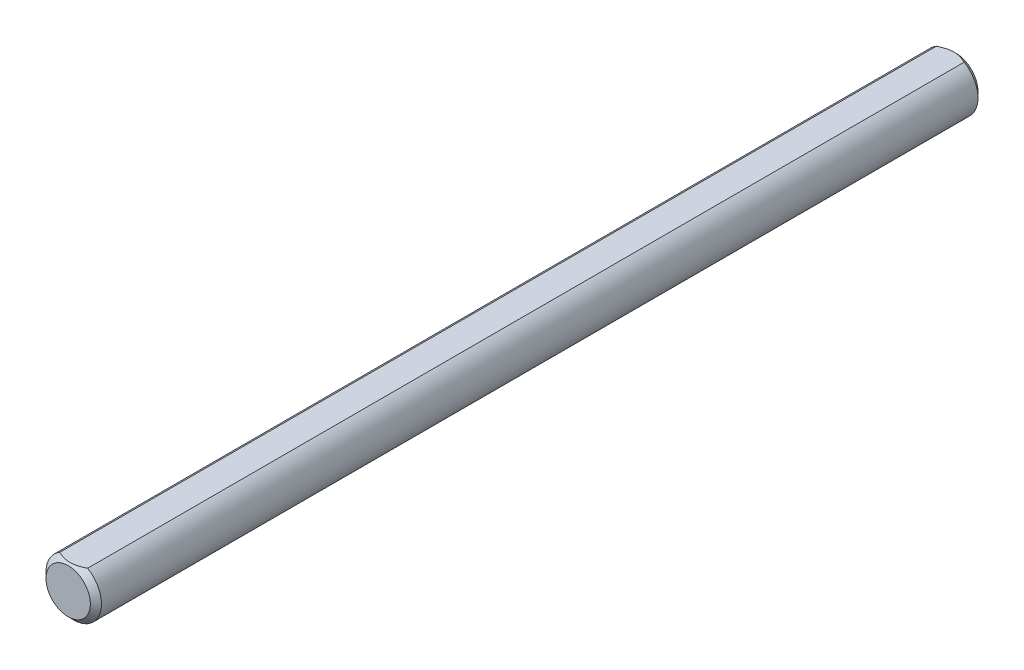
ISO-10303-21;
HEADER;
FILE_DESCRIPTION(('STEP AP214'),'2;1');
FILE_NAME('part.step','',(''),(''),'','','');
FILE_SCHEMA(('AUTOMOTIVE_DESIGN { 1 0 10303 214 1 1 1 1 }'));
ENDSEC;
DATA;
#1=APPLICATION_CONTEXT('core data for automotive mechanical design processes');
#2=APPLICATION_PROTOCOL_DEFINITION('international standard','automotive_design',2000,#1);
#3=PRODUCT_CONTEXT('',#1,'mechanical');
#4=PRODUCT('Part','Part','',(#3));
#5=PRODUCT_RELATED_PRODUCT_CATEGORY('part','',(#4));
#6=PRODUCT_DEFINITION_FORMATION('','',#4);
#7=PRODUCT_DEFINITION_CONTEXT('part definition',#1,'design');
#8=PRODUCT_DEFINITION('design','',#6,#7);
#9=PRODUCT_DEFINITION_SHAPE('','',#8);
#10=(LENGTH_UNIT() NAMED_UNIT(*) SI_UNIT(.MILLI.,.METRE.));
#11=(NAMED_UNIT(*) PLANE_ANGLE_UNIT() SI_UNIT($,.RADIAN.));
#12=(NAMED_UNIT(*) SI_UNIT($,.STERADIAN.) SOLID_ANGLE_UNIT());
#13=UNCERTAINTY_MEASURE_WITH_UNIT(LENGTH_MEASURE(1.E-05),#10,'distance_accuracy_value','');
#14=(GEOMETRIC_REPRESENTATION_CONTEXT(3) GLOBAL_UNCERTAINTY_ASSIGNED_CONTEXT((#13)) GLOBAL_UNIT_ASSIGNED_CONTEXT((#10,
#11,#12)) REPRESENTATION_CONTEXT('',''));
#15=CARTESIAN_POINT('',(0.,0.,0.));
#16=DIRECTION('',(0.,0.,1.));
#17=DIRECTION('',(1.,0.,0.));
#18=AXIS2_PLACEMENT_3D('',#15,#16,#17);
#19=CARTESIAN_POINT('',(0.,0.,50.8));
#20=DIRECTION('',(0.,0.,-1.));
#21=DIRECTION('',(-1.,0.,0.));
#22=AXIS2_PLACEMENT_3D('',#19,#20,#21);
#23=CYLINDRICAL_SURFACE('',#22,3.175);
#24=CARTESIAN_POINT('',(0.,0.,50.165));
#25=DIRECTION('',(0.,0.,1.));
#26=DIRECTION('',(1.,0.,0.));
#27=AXIS2_PLACEMENT_3D('',#24,#25,#26);
#28=CIRCLE('',#27,3.175);
#29=CARTESIAN_POINT('',(1.5875,2.74963065701559,50.165));
#30=VERTEX_POINT('',#29);
#31=CARTESIAN_POINT('',(-1.5875,2.74963065701559,50.165));
#32=VERTEX_POINT('',#31);
#33=EDGE_CURVE('E74',#30,#32,#28,.F.);
#34=ORIENTED_EDGE('',*,*,#33,.T.);
#35=DIRECTION('',(0.,0.,1.));
#36=VECTOR('',#35,1.);
#37=CARTESIAN_POINT('',(-1.5875,2.74963065701559,-50.8));
#38=LINE('',#37,#36);
#39=CARTESIAN_POINT('',(-1.5875,2.74963065701559,-50.165));
#40=VERTEX_POINT('',#39);
#41=EDGE_CURVE('E52',#40,#32,#38,.T.);
#42=ORIENTED_EDGE('',*,*,#41,.F.);
#43=CARTESIAN_POINT('',(0.,0.,-50.165));
#44=DIRECTION('',(0.,0.,1.));
#45=DIRECTION('',(1.,0.,0.));
#46=AXIS2_PLACEMENT_3D('',#43,#44,#45);
#47=CIRCLE('',#46,3.175);
#48=CARTESIAN_POINT('',(1.5875,2.74963065701559,-50.165));
#49=VERTEX_POINT('',#48);
#50=EDGE_CURVE('E73',#40,#49,#47,.T.);
#51=ORIENTED_EDGE('',*,*,#50,.T.);
#52=DIRECTION('',(0.,0.,1.));
#53=VECTOR('',#52,1.);
#54=CARTESIAN_POINT('',(1.5875,2.74963065701559,-50.8));
#55=LINE('',#54,#53);
#56=EDGE_CURVE('E62',#49,#30,#55,.T.);
#57=ORIENTED_EDGE('',*,*,#56,.T.);
#58=EDGE_LOOP('',(#34,#42,#51,#57));
#59=FACE_BOUND('',#58,.T.);
#60=ADVANCED_FACE('F33',(#59),#23,.T.);
#61=CARTESIAN_POINT('',(0.,0.,50.8));
#62=DIRECTION('',(0.,0.,1.));
#63=DIRECTION('',(1.,0.,0.));
#64=AXIS2_PLACEMENT_3D('',#61,#62,#63);
#65=PLANE('',#64);
#66=CARTESIAN_POINT('',(0.,0.,50.8));
#67=DIRECTION('',(0.,0.,1.));
#68=DIRECTION('',(1.,0.,0.));
#69=AXIS2_PLACEMENT_3D('',#66,#67,#68);
#70=CIRCLE('',#69,2.54);
#71=CARTESIAN_POINT('',(2.54,0.,50.8));
#72=VERTEX_POINT('',#71);
#73=EDGE_CURVE('E46',#72,#72,#70,.T.);
#74=ORIENTED_EDGE('',*,*,#73,.T.);
#75=EDGE_LOOP('',(#74));
#76=FACE_BOUND('',#75,.T.);
#77=ADVANCED_FACE('F84',(#76),#65,.T.);
#78=CARTESIAN_POINT('',(0.,0.,-50.8));
#79=DIRECTION('',(0.,0.,1.));
#80=DIRECTION('',(1.,0.,0.));
#81=AXIS2_PLACEMENT_3D('',#78,#79,#80);
#82=PLANE('',#81);
#83=CARTESIAN_POINT('',(0.,0.,-50.8));
#84=DIRECTION('',(0.,0.,1.));
#85=DIRECTION('',(1.,0.,0.));
#86=AXIS2_PLACEMENT_3D('',#83,#84,#85);
#87=CIRCLE('',#86,2.54000000000001);
#88=CARTESIAN_POINT('',(2.54000000000001,0.,-50.8));
#89=VERTEX_POINT('',#88);
#90=EDGE_CURVE('E76',#89,#89,#87,.F.);
#91=ORIENTED_EDGE('',*,*,#90,.T.);
#92=EDGE_LOOP('',(#91));
#93=FACE_BOUND('',#92,.T.);
#94=ADVANCED_FACE('F92',(#93),#82,.F.);
#95=CARTESIAN_POINT('',(0.,0.,-50.165));
#96=DIRECTION('',(0.,0.,1.));
#97=DIRECTION('',(1.,0.,0.));
#98=AXIS2_PLACEMENT_3D('',#95,#96,#97);
#99=CONICAL_SURFACE('',#98,3.175,0.785398163397451);
#100=CARTESIAN_POINT('',(-3.22896135223731,2.74963065701559,-49.0989317189838));
#101=CARTESIAN_POINT('',(-3.15061649550106,2.74963065701559,-49.158566524546));
#102=CARTESIAN_POINT('',(-3.07184009651264,2.74963065701559,-49.217643482025));
#103=CARTESIAN_POINT('',(-2.91325130568819,2.74963065701559,-49.3344297176183));
#104=CARTESIAN_POINT('',(-2.83343866506295,2.74963065701559,-49.3921386575258));
#105=CARTESIAN_POINT('',(-2.67202062852747,2.74963065701559,-49.5063475478051));
#106=CARTESIAN_POINT('',(-2.59040613970429,2.74963065701559,-49.5628346895372));
#107=CARTESIAN_POINT('',(-2.42580311622164,2.74963065701559,-49.6737635143344));
#108=CARTESIAN_POINT('',(-2.34281467809335,2.74963065701559,-49.7282053402285));
#109=CARTESIAN_POINT('',(-2.17021447787229,2.74963065701559,-49.8377738711657));
#110=CARTESIAN_POINT('',(-2.08050398524193,2.74963065701559,-49.8927458353402));
#111=CARTESIAN_POINT('',(-1.89900904678691,2.74963065701559,-49.9991469931979));
#112=CARTESIAN_POINT('',(-1.80722487525635,2.74963065701559,-50.0505766518349));
#113=CARTESIAN_POINT('',(-1.6215376036893,2.74963065701559,-50.1488148050514));
#114=CARTESIAN_POINT('',(-1.52764140922494,2.74963065701559,-50.1956362501767));
#115=CARTESIAN_POINT('',(-1.337247065721,2.74963065701559,-50.2836008153407));
#116=CARTESIAN_POINT('',(-1.24075014112708,2.74963065701559,-50.3247465535942));
#117=CARTESIAN_POINT('',(-1.05364742760749,2.74963065701559,-50.3965564372305));
#118=CARTESIAN_POINT('',(-0.963276425588638,2.74963065701559,-50.4278260439733));
#119=CARTESIAN_POINT('',(-0.7803037351611,2.74963065701559,-50.4831231873505));
#120=CARTESIAN_POINT('',(-0.687701898779459,2.74963065701559,-50.5071502421446));
#121=CARTESIAN_POINT('',(-0.502391431282847,2.74963065701559,-50.5462882908411));
#122=CARTESIAN_POINT('',(-0.40971644514675,2.74963065701559,-50.5615559547489));
#123=CARTESIAN_POINT('',(-0.22330633068526,2.74963065701559,-50.5828688420294));
#124=CARTESIAN_POINT('',(-0.129571403437362,2.74963065701559,-50.5889157860141));
#125=CARTESIAN_POINT('',(0.0543357559016831,2.74963065701559,-50.5913094852485));
#126=CARTESIAN_POINT('',(0.144503242552372,2.74963065701559,-50.5880280862278));
#127=CARTESIAN_POINT('',(0.324095543573417,2.74963065701559,-50.5727817719638));
#128=CARTESIAN_POINT('',(0.413520286896871,2.74963065701559,-50.5608160354814));
#129=CARTESIAN_POINT('',(0.592496066024077,2.74963065701559,-50.5286615235362));
#130=CARTESIAN_POINT('',(0.682021177379022,2.74963065701559,-50.5083305801752));
#131=CARTESIAN_POINT('',(0.859103373963829,2.74963065701559,-50.460545197954));
#132=CARTESIAN_POINT('',(0.94666060108879,2.74963065701559,-50.4330912745013));
#133=CARTESIAN_POINT('',(1.21954622680464,2.74963065701559,-50.3371294821897));
#134=CARTESIAN_POINT('',(1.40108594012668,2.74963065701559,-50.2578094527363));
#135=CARTESIAN_POINT('',(1.66675889489862,2.74963065701559,-50.1255539852257));
#136=CARTESIAN_POINT('',(1.75437488385019,2.74963065701559,-50.0791526611238));
#137=CARTESIAN_POINT('',(1.92761951465603,2.74963065701559,-49.9827692377677));
#138=CARTESIAN_POINT('',(2.01324850705459,2.74963065701559,-49.9327877765756));
#139=CARTESIAN_POINT('',(2.1785518428574,2.74963065701559,-49.8325138433061));
#140=CARTESIAN_POINT('',(2.25831097248805,2.74963065701559,-49.7823595590396));
#141=CARTESIAN_POINT('',(2.41646118640002,2.74963065701559,-49.6799282177625));
#142=CARTESIAN_POINT('',(2.49485216688182,2.74963065701559,-49.6276510006805));
#143=CARTESIAN_POINT('',(2.64980987258634,2.74963065701559,-49.5217831250554));
#144=CARTESIAN_POINT('',(2.72638621983964,2.74963065701559,-49.4682064917739));
#145=CARTESIAN_POINT('',(2.87849044969172,2.74963065701559,-49.3596270900169));
#146=CARTESIAN_POINT('',(2.95401861519267,2.74963065701559,-49.304624718309));
#147=CARTESIAN_POINT('',(3.02910770969629,2.74963065701559,-49.2490389555825));
#148=B_SPLINE_CURVE_WITH_KNOTS('',3,(#100,#101,#102,#103,#104,#105,#106,#107,#108,#109,#110,
#111,#112,#113,#114,#115,#116,#117,#118,#119,#120,#121,#122,#123,#124,#125,#126,#127,#128,#129,
#130,#131,#132,#133,#134,#135,#136,#137,#138,#139,#140,#141,#142,#143,#144,#145,#146,#147),
.UNSPECIFIED.,.F.,.F.,(4,2,2,2,2,2,2,2,2,2,2,2,2,2,2,2,2,2,2,2,2,2,2,4),(0.,0.295383449271209,
0.590839178498786,0.888580871622946,1.18630173399069,1.50187785569755,1.81741247644346,
2.13203338294821,2.44650866534175,2.73314264689635,3.01979569373833,3.30114758261625,
3.58244696402026,3.85269226293494,4.12296312107188,4.39803055604398,4.67307809311872,
5.26557071241314,5.56297998480383,5.86033638333469,6.14295523590882,6.42559543796928,
6.70595195130122,6.98623126477269),.UNSPECIFIED.);
#149=EDGE_CURVE('E57',#49,#40,#148,.F.);
#150=ORIENTED_EDGE('',*,*,#149,.F.);
#151=ORIENTED_EDGE('',*,*,#50,.F.);
#152=EDGE_LOOP('',(#150,#151));
#153=FACE_BOUND('',#152,.T.);
#154=ORIENTED_EDGE('',*,*,#90,.F.);
#155=EDGE_LOOP('',(#154));
#156=FACE_BOUND('',#155,.T.);
#157=ADVANCED_FACE('F71',(#153,#156),#99,.T.);
#158=CARTESIAN_POINT('',(0.,0.,50.8));
#159=DIRECTION('',(0.,0.,-1.));
#160=DIRECTION('',(-1.,0.,0.));
#161=AXIS2_PLACEMENT_3D('',#158,#159,#160);
#162=CONICAL_SURFACE('',#161,2.54,0.785398163397451);
#163=CARTESIAN_POINT('',(-3.22896135223731,2.74963065701559,49.0989317189838));
#164=CARTESIAN_POINT('',(-3.15061649550106,2.74963065701559,49.158566524546));
#165=CARTESIAN_POINT('',(-3.07184009651265,2.74963065701559,49.217643482025));
#166=CARTESIAN_POINT('',(-2.9132513056882,2.74963065701559,49.3344297176183));
#167=CARTESIAN_POINT('',(-2.83343866506295,2.74963065701559,49.3921386575258));
#168=CARTESIAN_POINT('',(-2.67202062852747,2.74963065701559,49.5063475478051));
#169=CARTESIAN_POINT('',(-2.59040613970429,2.74963065701559,49.5628346895372));
#170=CARTESIAN_POINT('',(-2.42580311622164,2.74963065701559,49.6737635143344));
#171=CARTESIAN_POINT('',(-2.34281467809335,2.74963065701559,49.7282053402285));
#172=CARTESIAN_POINT('',(-2.17021447787229,2.74963065701559,49.8377738711657));
#173=CARTESIAN_POINT('',(-2.08050398524193,2.74963065701559,49.8927458353402));
#174=CARTESIAN_POINT('',(-1.89900904678691,2.74963065701559,49.9991469931979));
#175=CARTESIAN_POINT('',(-1.80722487525635,2.74963065701559,50.0505766518349));
#176=CARTESIAN_POINT('',(-1.6215376036893,2.74963065701559,50.1488148050514));
#177=CARTESIAN_POINT('',(-1.52764140922494,2.74963065701559,50.1956362501767));
#178=CARTESIAN_POINT('',(-1.337247065721,2.74963065701559,50.2836008153407));
#179=CARTESIAN_POINT('',(-1.24075014112708,2.74963065701559,50.3247465535942));
#180=CARTESIAN_POINT('',(-1.05364742760749,2.74963065701559,50.3965564372305));
#181=CARTESIAN_POINT('',(-0.963276425588639,2.74963065701559,50.4278260439732));
#182=CARTESIAN_POINT('',(-0.780303735161101,2.74963065701559,50.4831231873505));
#183=CARTESIAN_POINT('',(-0.687701898779458,2.74963065701559,50.5071502421446));
#184=CARTESIAN_POINT('',(-0.502391431282846,2.74963065701559,50.5462882908411));
#185=CARTESIAN_POINT('',(-0.409716445146749,2.74963065701559,50.5615559547489));
#186=CARTESIAN_POINT('',(-0.223306330685259,2.74963065701559,50.5828688420294));
#187=CARTESIAN_POINT('',(-0.12957140343736,2.74963065701559,50.5889157860141));
#188=CARTESIAN_POINT('',(0.0543357559016852,2.74963065701559,50.5913094852485));
#189=CARTESIAN_POINT('',(0.144503242552375,2.74963065701559,50.5880280862278));
#190=CARTESIAN_POINT('',(0.324095543573419,2.74963065701559,50.5727817719638));
#191=CARTESIAN_POINT('',(0.413520286896873,2.74963065701559,50.5608160354814));
#192=CARTESIAN_POINT('',(0.592496066024079,2.74963065701559,50.5286615235361));
#193=CARTESIAN_POINT('',(0.682021177379025,2.74963065701559,50.5083305801752));
#194=CARTESIAN_POINT('',(0.859103373963832,2.74963065701559,50.460545197954));
#195=CARTESIAN_POINT('',(0.946660601088792,2.74963065701559,50.4330912745013));
#196=CARTESIAN_POINT('',(1.21954622680465,2.74963065701559,50.3371294821897));
#197=CARTESIAN_POINT('',(1.40108594012668,2.74963065701559,50.2578094527363));
#198=CARTESIAN_POINT('',(1.66675889489862,2.74963065701559,50.1255539852257));
#199=CARTESIAN_POINT('',(1.75437488385019,2.74963065701559,50.0791526611238));
#200=CARTESIAN_POINT('',(1.92761951465604,2.74963065701559,49.9827692377677));
#201=CARTESIAN_POINT('',(2.0132485070546,2.74963065701559,49.9327877765756));
#202=CARTESIAN_POINT('',(2.17855184285741,2.74963065701559,49.8325138433061));
#203=CARTESIAN_POINT('',(2.25831097248805,2.74963065701559,49.7823595590396));
#204=CARTESIAN_POINT('',(2.41646118640002,2.74963065701559,49.6799282177625));
#205=CARTESIAN_POINT('',(2.49485216688183,2.74963065701559,49.6276510006805));
#206=CARTESIAN_POINT('',(2.64980987258635,2.74963065701559,49.5217831250554));
#207=CARTESIAN_POINT('',(2.72638621983965,2.74963065701559,49.4682064917738));
#208=CARTESIAN_POINT('',(2.87849044969173,2.74963065701559,49.3596270900169));
#209=CARTESIAN_POINT('',(2.95401861519268,2.74963065701559,49.304624718309));
#210=CARTESIAN_POINT('',(3.02910770969629,2.74963065701559,49.2490389555825));
#211=B_SPLINE_CURVE_WITH_KNOTS('',3,(#163,#164,#165,#166,#167,#168,#169,#170,#171,#172,#173,
#174,#175,#176,#177,#178,#179,#180,#181,#182,#183,#184,#185,#186,#187,#188,#189,#190,#191,#192,
#193,#194,#195,#196,#197,#198,#199,#200,#201,#202,#203,#204,#205,#206,#207,#208,#209,#210),
.UNSPECIFIED.,.F.,.F.,(4,2,2,2,2,2,2,2,2,2,2,2,2,2,2,2,2,2,2,2,2,2,2,4),(0.,0.295383449271205,
0.590839178498788,0.888580871622949,1.1863017339907,1.50187785569756,1.81741247644347,
2.13203338294821,2.44650866534175,2.73314264689635,3.01979569373833,3.30114758261625,
3.58244696402026,3.85269226293494,4.12296312107188,4.39803055604399,4.67307809311872,
5.26557071241314,5.56297998480384,5.8603363833347,6.14295523590882,6.42559543796928,
6.70595195130123,6.98623126477269),.UNSPECIFIED.);
#212=EDGE_CURVE('E11',#32,#30,#211,.T.);
#213=ORIENTED_EDGE('',*,*,#212,.F.);
#214=ORIENTED_EDGE('',*,*,#33,.F.);
#215=EDGE_LOOP('',(#213,#214));
#216=FACE_BOUND('',#215,.T.);
#217=ORIENTED_EDGE('',*,*,#73,.F.);
#218=EDGE_LOOP('',(#217));
#219=FACE_BOUND('',#218,.T.);
#220=ADVANCED_FACE('F35',(#216,#219),#162,.T.);
#221=CARTESIAN_POINT('',(-1.5875,2.74963065701559,-50.8));
#222=DIRECTION('',(0.,-1.,0.));
#223=DIRECTION('',(0.,0.,-1.));
#224=AXIS2_PLACEMENT_3D('',#221,#222,#223);
#225=PLANE('',#224);
#226=ORIENTED_EDGE('',*,*,#149,.T.);
#227=ORIENTED_EDGE('',*,*,#41,.T.);
#228=ORIENTED_EDGE('',*,*,#212,.T.);
#229=ORIENTED_EDGE('',*,*,#56,.F.);
#230=EDGE_LOOP('',(#226,#227,#228,#229));
#231=FACE_BOUND('',#230,.T.);
#232=ADVANCED_FACE('F63',(#231),#225,.F.);
#233=CLOSED_SHELL('',(#60,#77,#94,#157,#220,#232));
#234=MANIFOLD_SOLID_BREP('B2',#233);
#235=ADVANCED_BREP_SHAPE_REPRESENTATION('',(#18,#234),#14);
#236=SHAPE_DEFINITION_REPRESENTATION(#9,#235);
ENDSEC;
END-ISO-10303-21;
